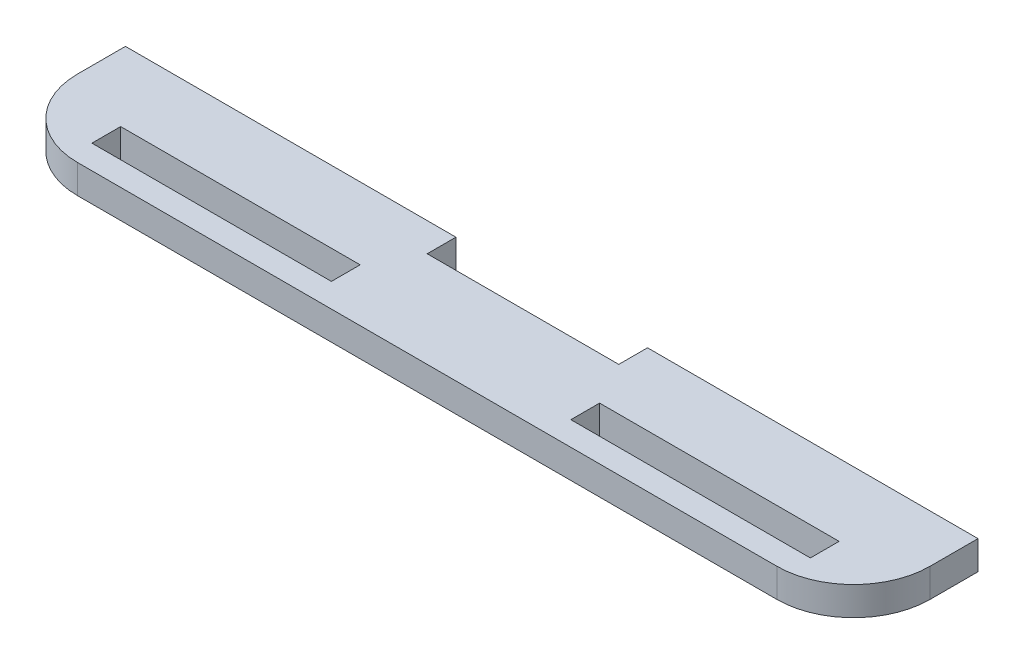
ISO-10303-21;
HEADER;
FILE_DESCRIPTION(('STEP AP214'),'2;1');
FILE_NAME('part.step','',(''),(''),'','','');
FILE_SCHEMA(('AUTOMOTIVE_DESIGN { 1 0 10303 214 1 1 1 1 }'));
ENDSEC;
DATA;
#1=APPLICATION_CONTEXT('core data for automotive mechanical design processes');
#2=APPLICATION_PROTOCOL_DEFINITION('international standard','automotive_design',2000,#1);
#3=PRODUCT_CONTEXT('',#1,'mechanical');
#4=PRODUCT('Part','Part','',(#3));
#5=PRODUCT_RELATED_PRODUCT_CATEGORY('part','',(#4));
#6=PRODUCT_DEFINITION_FORMATION('','',#4);
#7=PRODUCT_DEFINITION_CONTEXT('part definition',#1,'design');
#8=PRODUCT_DEFINITION('design','',#6,#7);
#9=PRODUCT_DEFINITION_SHAPE('','',#8);
#10=(LENGTH_UNIT() NAMED_UNIT(*) SI_UNIT(.MILLI.,.METRE.));
#11=(NAMED_UNIT(*) PLANE_ANGLE_UNIT() SI_UNIT($,.RADIAN.));
#12=(NAMED_UNIT(*) SI_UNIT($,.STERADIAN.) SOLID_ANGLE_UNIT());
#13=UNCERTAINTY_MEASURE_WITH_UNIT(LENGTH_MEASURE(1.E-05),#10,'distance_accuracy_value','');
#14=(GEOMETRIC_REPRESENTATION_CONTEXT(3) GLOBAL_UNCERTAINTY_ASSIGNED_CONTEXT((#13)) GLOBAL_UNIT_ASSIGNED_CONTEXT((#10,
#11,#12)) REPRESENTATION_CONTEXT('',''));
#15=CARTESIAN_POINT('',(0.,0.,0.));
#16=DIRECTION('',(0.,0.,1.));
#17=DIRECTION('',(1.,0.,0.));
#18=AXIS2_PLACEMENT_3D('',#15,#16,#17);
#19=CARTESIAN_POINT('',(0.,0.,-3.));
#20=DIRECTION('',(0.,0.,-1.));
#21=DIRECTION('',(0.,1.,0.));
#22=AXIS2_PLACEMENT_3D('',#19,#20,#21);
#23=PLANE('',#22);
#24=DIRECTION('',(0.,-1.,0.));
#25=VECTOR('',#24,1.);
#26=CARTESIAN_POINT('',(10.,0.,-3.));
#27=LINE('',#26,#25);
#28=CARTESIAN_POINT('',(10.,24.,-3.));
#29=VERTEX_POINT('',#28);
#30=CARTESIAN_POINT('',(10.,21.,-3.));
#31=VERTEX_POINT('',#30);
#32=EDGE_CURVE('E166',#29,#31,#27,.T.);
#33=ORIENTED_EDGE('',*,*,#32,.F.);
#34=DIRECTION('',(-1.,0.,0.));
#35=VECTOR('',#34,1.);
#36=CARTESIAN_POINT('',(44.5,24.,-3.));
#37=LINE('',#36,#35);
#38=CARTESIAN_POINT('',(44.5,24.,-3.));
#39=VERTEX_POINT('',#38);
#40=EDGE_CURVE('E180',#39,#29,#37,.T.);
#41=ORIENTED_EDGE('',*,*,#40,.F.);
#42=DIRECTION('',(0.,1.,0.));
#43=VECTOR('',#42,1.);
#44=CARTESIAN_POINT('',(44.5,24.,-3.));
#45=LINE('',#44,#43);
#46=CARTESIAN_POINT('',(44.5,21.,-3.));
#47=VERTEX_POINT('',#46);
#48=EDGE_CURVE('E202',#47,#39,#45,.T.);
#49=ORIENTED_EDGE('',*,*,#48,.F.);
#50=DIRECTION('',(1.,0.,0.));
#51=VECTOR('',#50,1.);
#52=CARTESIAN_POINT('',(44.5,21.,-3.));
#53=LINE('',#52,#51);
#54=EDGE_CURVE('E183',#31,#47,#53,.T.);
#55=ORIENTED_EDGE('',*,*,#54,.F.);
#56=EDGE_LOOP('',(#33,#41,#49,#55));
#57=FACE_BOUND('',#56,.T.);
#58=ADVANCED_FACE('F37',(#57),#23,.T.);
#59=CARTESIAN_POINT('',(44.5,21.,99.0505474435727));
#60=DIRECTION('',(0.,1.,0.));
#61=DIRECTION('',(0.,0.,1.));
#62=AXIS2_PLACEMENT_3D('',#59,#60,#61);
#63=PLANE('',#62);
#64=DIRECTION('',(1.,0.,0.));
#65=VECTOR('',#64,1.);
#66=CARTESIAN_POINT('',(12.5,21.,4.49999999999999));
#67=LINE('',#66,#65);
#68=CARTESIAN_POINT('',(12.5,21.,4.49999999999999));
#69=VERTEX_POINT('',#68);
#70=CARTESIAN_POINT('',(37.5,21.,4.49999999999999));
#71=VERTEX_POINT('',#70);
#72=EDGE_CURVE('E281',#69,#71,#67,.T.);
#73=ORIENTED_EDGE('',*,*,#72,.F.);
#74=DIRECTION('',(0.,0.,-1.));
#75=VECTOR('',#74,1.);
#76=CARTESIAN_POINT('',(12.5,21.,4.49999999999999));
#77=LINE('',#76,#75);
#78=CARTESIAN_POINT('',(12.5,21.,7.5));
#79=VERTEX_POINT('',#78);
#80=EDGE_CURVE('E275',#79,#69,#77,.T.);
#81=ORIENTED_EDGE('',*,*,#80,.F.);
#82=DIRECTION('',(-1.,0.,0.));
#83=VECTOR('',#82,1.);
#84=CARTESIAN_POINT('',(12.5,21.,7.5));
#85=LINE('',#84,#83);
#86=CARTESIAN_POINT('',(37.5,21.,7.50000000000001));
#87=VERTEX_POINT('',#86);
#88=EDGE_CURVE('E287',#87,#79,#85,.T.);
#89=ORIENTED_EDGE('',*,*,#88,.F.);
#90=DIRECTION('',(0.,0.,1.));
#91=VECTOR('',#90,1.);
#92=CARTESIAN_POINT('',(37.5,21.,4.49999999999999));
#93=LINE('',#92,#91);
#94=EDGE_CURVE('E284',#71,#87,#93,.T.);
#95=ORIENTED_EDGE('',*,*,#94,.F.);
#96=EDGE_LOOP('',(#73,#81,#89,#95));
#97=FACE_BOUND('',#96,.T.);
#98=DIRECTION('',(1.,0.,0.));
#99=VECTOR('',#98,1.);
#100=CARTESIAN_POINT('',(-37.5,21.,4.49999999999999));
#101=LINE('',#100,#99);
#102=CARTESIAN_POINT('',(-37.5,21.,4.49999999999999));
#103=VERTEX_POINT('',#102);
#104=CARTESIAN_POINT('',(-12.5,21.,4.49999999999999));
#105=VERTEX_POINT('',#104);
#106=EDGE_CURVE('E301',#103,#105,#101,.T.);
#107=ORIENTED_EDGE('',*,*,#106,.F.);
#108=DIRECTION('',(0.,0.,-1.));
#109=VECTOR('',#108,1.);
#110=CARTESIAN_POINT('',(-37.5,21.,4.49999999999999));
#111=LINE('',#110,#109);
#112=CARTESIAN_POINT('',(-37.5,21.,7.5));
#113=VERTEX_POINT('',#112);
#114=EDGE_CURVE('E293',#113,#103,#111,.T.);
#115=ORIENTED_EDGE('',*,*,#114,.F.);
#116=DIRECTION('',(-1.,0.,0.));
#117=VECTOR('',#116,1.);
#118=CARTESIAN_POINT('',(-37.5,21.,7.5));
#119=LINE('',#118,#117);
#120=CARTESIAN_POINT('',(-12.5,21.,7.5));
#121=VERTEX_POINT('',#120);
#122=EDGE_CURVE('E307',#121,#113,#119,.T.);
#123=ORIENTED_EDGE('',*,*,#122,.F.);
#124=DIRECTION('',(0.,0.,1.));
#125=VECTOR('',#124,1.);
#126=CARTESIAN_POINT('',(-12.5,21.,4.49999999999999));
#127=LINE('',#126,#125);
#128=EDGE_CURVE('E304',#105,#121,#127,.T.);
#129=ORIENTED_EDGE('',*,*,#128,.F.);
#130=EDGE_LOOP('',(#107,#115,#123,#129));
#131=FACE_BOUND('',#130,.T.);
#132=DIRECTION('',(-1.,0.,0.));
#133=VECTOR('',#132,1.);
#134=CARTESIAN_POINT('',(44.5,21.,9.99999999999999));
#135=LINE('',#134,#133);
#136=CARTESIAN_POINT('',(36.5,21.,9.99999999999999));
#137=VERTEX_POINT('',#136);
#138=CARTESIAN_POINT('',(-36.5,21.,9.99999999999999));
#139=VERTEX_POINT('',#138);
#140=EDGE_CURVE('E212',#137,#139,#135,.T.);
#141=ORIENTED_EDGE('',*,*,#140,.T.);
#142=CARTESIAN_POINT('',(-36.5,21.,2.));
#143=DIRECTION('',(0.,1.,0.));
#144=DIRECTION('',(0.,0.,1.));
#145=AXIS2_PLACEMENT_3D('',#142,#143,#144);
#146=CIRCLE('',#145,8.);
#147=CARTESIAN_POINT('',(-44.5,21.,2.));
#148=VERTEX_POINT('',#147);
#149=EDGE_CURVE('E45',#139,#148,#146,.F.);
#150=ORIENTED_EDGE('',*,*,#149,.T.);
#151=DIRECTION('',(0.,0.,-1.));
#152=VECTOR('',#151,1.);
#153=CARTESIAN_POINT('',(-44.5,21.,99.0505474435727));
#154=LINE('',#153,#152);
#155=CARTESIAN_POINT('',(-44.5,21.,-3.));
#156=VERTEX_POINT('',#155);
#157=EDGE_CURVE('E214',#148,#156,#154,.T.);
#158=ORIENTED_EDGE('',*,*,#157,.T.);
#159=CARTESIAN_POINT('',(-10.,21.,-3.));
#160=VERTEX_POINT('',#159);
#161=EDGE_CURVE('E205',#156,#160,#53,.T.);
#162=ORIENTED_EDGE('',*,*,#161,.T.);
#163=DIRECTION('',(0.,0.,1.));
#164=VECTOR('',#163,1.);
#165=CARTESIAN_POINT('',(-10.,21.,99.0505474435727));
#166=LINE('',#165,#164);
#167=CARTESIAN_POINT('',(-10.,21.,0.));
#168=VERTEX_POINT('',#167);
#169=EDGE_CURVE('E273',#160,#168,#166,.T.);
#170=ORIENTED_EDGE('',*,*,#169,.T.);
#171=DIRECTION('',(1.,0.,0.));
#172=VECTOR('',#171,1.);
#173=CARTESIAN_POINT('',(44.5,21.,0.));
#174=LINE('',#173,#172);
#175=CARTESIAN_POINT('',(10.,21.,0.));
#176=VERTEX_POINT('',#175);
#177=EDGE_CURVE('E272',#168,#176,#174,.T.);
#178=ORIENTED_EDGE('',*,*,#177,.T.);
#179=DIRECTION('',(0.,0.,-1.));
#180=VECTOR('',#179,1.);
#181=CARTESIAN_POINT('',(10.,21.,99.0505474435727));
#182=LINE('',#181,#180);
#183=EDGE_CURVE('E270',#176,#31,#182,.T.);
#184=ORIENTED_EDGE('',*,*,#183,.T.);
#185=ORIENTED_EDGE('',*,*,#54,.T.);
#186=DIRECTION('',(0.,0.,-1.));
#187=VECTOR('',#186,1.);
#188=CARTESIAN_POINT('',(44.5,21.,99.0505474435727));
#189=LINE('',#188,#187);
#190=CARTESIAN_POINT('',(44.5,21.,2.));
#191=VERTEX_POINT('',#190);
#192=EDGE_CURVE('E204',#191,#47,#189,.T.);
#193=ORIENTED_EDGE('',*,*,#192,.F.);
#194=CARTESIAN_POINT('',(36.5,21.,2.));
#195=DIRECTION('',(0.,1.,0.));
#196=DIRECTION('',(0.,0.,1.));
#197=AXIS2_PLACEMENT_3D('',#194,#195,#196);
#198=CIRCLE('',#197,8.);
#199=EDGE_CURVE('E52',#191,#137,#198,.F.);
#200=ORIENTED_EDGE('',*,*,#199,.T.);
#201=EDGE_LOOP('',(#141,#150,#158,#162,#170,#178,#184,#185,#193,#200));
#202=FACE_BOUND('',#201,.T.);
#203=ADVANCED_FACE('F256',(#97,#131,#202),#63,.F.);
#204=CARTESIAN_POINT('',(-44.5,24.,99.0505474435727));
#205=DIRECTION('',(1.,0.,0.));
#206=DIRECTION('',(0.,0.,-1.));
#207=AXIS2_PLACEMENT_3D('',#204,#205,#206);
#208=PLANE('',#207);
#209=ORIENTED_EDGE('',*,*,#157,.F.);
#210=DIRECTION('',(0.,1.,0.));
#211=VECTOR('',#210,1.);
#212=CARTESIAN_POINT('',(-44.5,24.,2.));
#213=LINE('',#212,#211);
#214=CARTESIAN_POINT('',(-44.5,24.,2.));
#215=VERTEX_POINT('',#214);
#216=EDGE_CURVE('E184',#148,#215,#213,.T.);
#217=ORIENTED_EDGE('',*,*,#216,.T.);
#218=DIRECTION('',(0.,0.,-1.));
#219=VECTOR('',#218,1.);
#220=CARTESIAN_POINT('',(-44.5,24.,99.0505474435727));
#221=LINE('',#220,#219);
#222=CARTESIAN_POINT('',(-44.5,24.,-3.));
#223=VERTEX_POINT('',#222);
#224=EDGE_CURVE('E216',#215,#223,#221,.T.);
#225=ORIENTED_EDGE('',*,*,#224,.T.);
#226=DIRECTION('',(0.,-1.,0.));
#227=VECTOR('',#226,1.);
#228=CARTESIAN_POINT('',(-44.5,24.,-3.));
#229=LINE('',#228,#227);
#230=EDGE_CURVE('E191',#223,#156,#229,.T.);
#231=ORIENTED_EDGE('',*,*,#230,.T.);
#232=EDGE_LOOP('',(#209,#217,#225,#231));
#233=FACE_BOUND('',#232,.T.);
#234=ADVANCED_FACE('F261',(#233),#208,.F.);
#235=CARTESIAN_POINT('',(44.5,24.,99.0505474435727));
#236=DIRECTION('',(0.,-1.,0.));
#237=DIRECTION('',(0.,0.,-1.));
#238=AXIS2_PLACEMENT_3D('',#235,#236,#237);
#239=PLANE('',#238);
#240=DIRECTION('',(-1.,0.,0.));
#241=VECTOR('',#240,1.);
#242=CARTESIAN_POINT('',(44.5,24.,7.50000000000001));
#243=LINE('',#242,#241);
#244=CARTESIAN_POINT('',(37.5,24.,7.50000000000001));
#245=VERTEX_POINT('',#244);
#246=CARTESIAN_POINT('',(12.5,24.,7.5));
#247=VERTEX_POINT('',#246);
#248=EDGE_CURVE('E237',#245,#247,#243,.T.);
#249=ORIENTED_EDGE('',*,*,#248,.T.);
#250=DIRECTION('',(0.,0.,-1.));
#251=VECTOR('',#250,1.);
#252=CARTESIAN_POINT('',(12.5000000000001,24.,99.0505474435728));
#253=LINE('',#252,#251);
#254=CARTESIAN_POINT('',(12.5,24.,4.49999999999999));
#255=VERTEX_POINT('',#254);
#256=EDGE_CURVE('E240',#247,#255,#253,.T.);
#257=ORIENTED_EDGE('',*,*,#256,.T.);
#258=DIRECTION('',(1.,0.,0.));
#259=VECTOR('',#258,1.);
#260=CARTESIAN_POINT('',(44.5,24.,4.49999999999999));
#261=LINE('',#260,#259);
#262=CARTESIAN_POINT('',(37.5,24.,4.49999999999999));
#263=VERTEX_POINT('',#262);
#264=EDGE_CURVE('E231',#255,#263,#261,.T.);
#265=ORIENTED_EDGE('',*,*,#264,.T.);
#266=DIRECTION('',(0.,0.,1.));
#267=VECTOR('',#266,1.);
#268=CARTESIAN_POINT('',(37.5,24.,99.0505474435727));
#269=LINE('',#268,#267);
#270=EDGE_CURVE('E234',#263,#245,#269,.T.);
#271=ORIENTED_EDGE('',*,*,#270,.T.);
#272=EDGE_LOOP('',(#249,#257,#265,#271));
#273=FACE_BOUND('',#272,.T.);
#274=DIRECTION('',(-1.,0.,0.));
#275=VECTOR('',#274,1.);
#276=CARTESIAN_POINT('',(44.5,24.,7.50000000000001));
#277=LINE('',#276,#275);
#278=CARTESIAN_POINT('',(-12.5,24.,7.5));
#279=VERTEX_POINT('',#278);
#280=CARTESIAN_POINT('',(-37.5,24.,7.5));
#281=VERTEX_POINT('',#280);
#282=EDGE_CURVE('E225',#279,#281,#277,.T.);
#283=ORIENTED_EDGE('',*,*,#282,.T.);
#284=DIRECTION('',(0.,0.,-1.));
#285=VECTOR('',#284,1.);
#286=CARTESIAN_POINT('',(-37.5,24.,99.0505474435727));
#287=LINE('',#286,#285);
#288=CARTESIAN_POINT('',(-37.5,24.,4.49999999999999));
#289=VERTEX_POINT('',#288);
#290=EDGE_CURVE('E228',#281,#289,#287,.T.);
#291=ORIENTED_EDGE('',*,*,#290,.T.);
#292=DIRECTION('',(1.,0.,0.));
#293=VECTOR('',#292,1.);
#294=CARTESIAN_POINT('',(44.5,24.,4.49999999999999));
#295=LINE('',#294,#293);
#296=CARTESIAN_POINT('',(-12.5,24.,4.49999999999999));
#297=VERTEX_POINT('',#296);
#298=EDGE_CURVE('E211',#289,#297,#295,.T.);
#299=ORIENTED_EDGE('',*,*,#298,.T.);
#300=DIRECTION('',(0.,0.,1.));
#301=VECTOR('',#300,1.);
#302=CARTESIAN_POINT('',(-12.5,24.,99.0505474435727));
#303=LINE('',#302,#301);
#304=EDGE_CURVE('E222',#297,#279,#303,.T.);
#305=ORIENTED_EDGE('',*,*,#304,.T.);
#306=EDGE_LOOP('',(#283,#291,#299,#305));
#307=FACE_BOUND('',#306,.T.);
#308=ORIENTED_EDGE('',*,*,#224,.F.);
#309=CARTESIAN_POINT('',(-36.5,24.,2.));
#310=DIRECTION('',(0.,-1.,0.));
#311=DIRECTION('',(0.,0.,-1.));
#312=AXIS2_PLACEMENT_3D('',#309,#310,#311);
#313=CIRCLE('',#312,8.);
#314=CARTESIAN_POINT('',(-36.5,24.,9.99999999999999));
#315=VERTEX_POINT('',#314);
#316=EDGE_CURVE('E248',#215,#315,#313,.F.);
#317=ORIENTED_EDGE('',*,*,#316,.T.);
#318=DIRECTION('',(1.,0.,0.));
#319=VECTOR('',#318,1.);
#320=CARTESIAN_POINT('',(44.5,24.,9.99999999999999));
#321=LINE('',#320,#319);
#322=CARTESIAN_POINT('',(36.5,24.,9.99999999999999));
#323=VERTEX_POINT('',#322);
#324=EDGE_CURVE('E208',#315,#323,#321,.T.);
#325=ORIENTED_EDGE('',*,*,#324,.T.);
#326=CARTESIAN_POINT('',(36.5,24.,2.));
#327=DIRECTION('',(0.,-1.,0.));
#328=DIRECTION('',(0.,0.,-1.));
#329=AXIS2_PLACEMENT_3D('',#326,#327,#328);
#330=CIRCLE('',#329,8.);
#331=CARTESIAN_POINT('',(44.5,24.,2.));
#332=VERTEX_POINT('',#331);
#333=EDGE_CURVE('E246',#323,#332,#330,.F.);
#334=ORIENTED_EDGE('',*,*,#333,.T.);
#335=DIRECTION('',(0.,0.,-1.));
#336=VECTOR('',#335,1.);
#337=CARTESIAN_POINT('',(44.5,24.,99.0505474435727));
#338=LINE('',#337,#336);
#339=EDGE_CURVE('E190',#332,#39,#338,.T.);
#340=ORIENTED_EDGE('',*,*,#339,.T.);
#341=ORIENTED_EDGE('',*,*,#40,.T.);
#342=DIRECTION('',(0.,0.,-1.));
#343=VECTOR('',#342,1.);
#344=CARTESIAN_POINT('',(10.,24.,-3.));
#345=LINE('',#344,#343);
#346=CARTESIAN_POINT('',(10.,24.,0.));
#347=VERTEX_POINT('',#346);
#348=EDGE_CURVE('E163',#347,#29,#345,.T.);
#349=ORIENTED_EDGE('',*,*,#348,.F.);
#350=DIRECTION('',(1.,0.,0.));
#351=VECTOR('',#350,1.);
#352=CARTESIAN_POINT('',(10.,24.,0.));
#353=LINE('',#352,#351);
#354=CARTESIAN_POINT('',(-10.,24.,0.));
#355=VERTEX_POINT('',#354);
#356=EDGE_CURVE('E366',#355,#347,#353,.T.);
#357=ORIENTED_EDGE('',*,*,#356,.F.);
#358=DIRECTION('',(0.,0.,1.));
#359=VECTOR('',#358,1.);
#360=CARTESIAN_POINT('',(-10.,24.,-3.));
#361=LINE('',#360,#359);
#362=CARTESIAN_POINT('',(-10.,24.,-3.));
#363=VERTEX_POINT('',#362);
#364=EDGE_CURVE('E174',#363,#355,#361,.T.);
#365=ORIENTED_EDGE('',*,*,#364,.F.);
#366=EDGE_CURVE('E192',#363,#223,#37,.T.);
#367=ORIENTED_EDGE('',*,*,#366,.T.);
#368=EDGE_LOOP('',(#308,#317,#325,#334,#340,#341,#349,#357,#365,#367));
#369=FACE_BOUND('',#368,.T.);
#370=ADVANCED_FACE('F188',(#273,#307,#369),#239,.F.);
#371=CARTESIAN_POINT('',(44.5,24.,99.0505474435727));
#372=DIRECTION('',(-1.,0.,0.));
#373=DIRECTION('',(0.,0.,1.));
#374=AXIS2_PLACEMENT_3D('',#371,#372,#373);
#375=PLANE('',#374);
#376=ORIENTED_EDGE('',*,*,#339,.F.);
#377=DIRECTION('',(0.,-1.,0.));
#378=VECTOR('',#377,1.);
#379=CARTESIAN_POINT('',(44.5,24.,2.));
#380=LINE('',#379,#378);
#381=EDGE_CURVE('E11',#332,#191,#380,.T.);
#382=ORIENTED_EDGE('',*,*,#381,.T.);
#383=ORIENTED_EDGE('',*,*,#192,.T.);
#384=ORIENTED_EDGE('',*,*,#48,.T.);
#385=EDGE_LOOP('',(#376,#382,#383,#384));
#386=FACE_BOUND('',#385,.T.);
#387=ADVANCED_FACE('F267',(#386),#375,.F.);
#388=CARTESIAN_POINT('',(0.,0.,10.));
#389=DIRECTION('',(0.,0.,-1.));
#390=DIRECTION('',(-1.,0.,0.));
#391=AXIS2_PLACEMENT_3D('',#388,#389,#390);
#392=PLANE('',#391);
#393=ORIENTED_EDGE('',*,*,#324,.F.);
#394=DIRECTION('',(0.,1.,0.));
#395=VECTOR('',#394,1.);
#396=CARTESIAN_POINT('',(-36.5,0.,10.));
#397=LINE('',#396,#395);
#398=EDGE_CURVE('E59',#315,#139,#397,.F.);
#399=ORIENTED_EDGE('',*,*,#398,.T.);
#400=ORIENTED_EDGE('',*,*,#140,.F.);
#401=DIRECTION('',(0.,-1.,0.));
#402=VECTOR('',#401,1.);
#403=CARTESIAN_POINT('',(36.5,0.,10.));
#404=LINE('',#403,#402);
#405=EDGE_CURVE('E250',#137,#323,#404,.F.);
#406=ORIENTED_EDGE('',*,*,#405,.T.);
#407=EDGE_LOOP('',(#393,#399,#400,#406));
#408=FACE_BOUND('',#407,.T.);
#409=ADVANCED_FACE('F265',(#408),#392,.F.);
#410=DIRECTION('',(0.,1.,0.));
#411=VECTOR('',#410,1.);
#412=CARTESIAN_POINT('',(-10.,0.,-3.));
#413=LINE('',#412,#411);
#414=EDGE_CURVE('E185',#160,#363,#413,.T.);
#415=ORIENTED_EDGE('',*,*,#414,.F.);
#416=ORIENTED_EDGE('',*,*,#161,.F.);
#417=ORIENTED_EDGE('',*,*,#230,.F.);
#418=ORIENTED_EDGE('',*,*,#366,.F.);
#419=EDGE_LOOP('',(#415,#416,#417,#418));
#420=FACE_BOUND('',#419,.T.);
#421=ADVANCED_FACE('F339',(#420),#23,.T.);
#422=CARTESIAN_POINT('',(-37.5,31.,4.49999999999999));
#423=DIRECTION('',(-1.,0.,0.));
#424=DIRECTION('',(0.,0.,1.));
#425=AXIS2_PLACEMENT_3D('',#422,#423,#424);
#426=PLANE('',#425);
#427=DIRECTION('',(0.,-1.,0.));
#428=VECTOR('',#427,1.);
#429=CARTESIAN_POINT('',(-37.5,31.,7.5));
#430=LINE('',#429,#428);
#431=EDGE_CURVE('E197',#281,#113,#430,.T.);
#432=ORIENTED_EDGE('',*,*,#431,.T.);
#433=ORIENTED_EDGE('',*,*,#114,.T.);
#434=DIRECTION('',(0.,-1.,0.));
#435=VECTOR('',#434,1.);
#436=CARTESIAN_POINT('',(-37.5,31.,4.49999999999999));
#437=LINE('',#436,#435);
#438=EDGE_CURVE('E200',#289,#103,#437,.T.);
#439=ORIENTED_EDGE('',*,*,#438,.F.);
#440=ORIENTED_EDGE('',*,*,#290,.F.);
#441=EDGE_LOOP('',(#432,#433,#439,#440));
#442=FACE_BOUND('',#441,.T.);
#443=ADVANCED_FACE('F330',(#442),#426,.F.);
#444=CARTESIAN_POINT('',(-37.5,31.,7.5));
#445=DIRECTION('',(0.,0.,1.));
#446=DIRECTION('',(1.,0.,0.));
#447=AXIS2_PLACEMENT_3D('',#444,#445,#446);
#448=PLANE('',#447);
#449=DIRECTION('',(0.,-1.,0.));
#450=VECTOR('',#449,1.);
#451=CARTESIAN_POINT('',(-12.5,31.,7.5));
#452=LINE('',#451,#450);
#453=EDGE_CURVE('E311',#279,#121,#452,.T.);
#454=ORIENTED_EDGE('',*,*,#453,.T.);
#455=ORIENTED_EDGE('',*,*,#122,.T.);
#456=ORIENTED_EDGE('',*,*,#431,.F.);
#457=ORIENTED_EDGE('',*,*,#282,.F.);
#458=EDGE_LOOP('',(#454,#455,#456,#457));
#459=FACE_BOUND('',#458,.T.);
#460=ADVANCED_FACE('F331',(#459),#448,.F.);
#461=CARTESIAN_POINT('',(-12.5,31.,4.49999999999999));
#462=DIRECTION('',(1.,0.,0.));
#463=DIRECTION('',(0.,0.,-1.));
#464=AXIS2_PLACEMENT_3D('',#461,#462,#463);
#465=PLANE('',#464);
#466=DIRECTION('',(0.,-1.,0.));
#467=VECTOR('',#466,1.);
#468=CARTESIAN_POINT('',(-12.5,31.,4.49999999999999));
#469=LINE('',#468,#467);
#470=EDGE_CURVE('E312',#297,#105,#469,.T.);
#471=ORIENTED_EDGE('',*,*,#470,.T.);
#472=ORIENTED_EDGE('',*,*,#128,.T.);
#473=ORIENTED_EDGE('',*,*,#453,.F.);
#474=ORIENTED_EDGE('',*,*,#304,.F.);
#475=EDGE_LOOP('',(#471,#472,#473,#474));
#476=FACE_BOUND('',#475,.T.);
#477=ADVANCED_FACE('F326',(#476),#465,.F.);
#478=CARTESIAN_POINT('',(-37.5,31.,4.49999999999999));
#479=DIRECTION('',(0.,0.,-1.));
#480=DIRECTION('',(-1.,0.,0.));
#481=AXIS2_PLACEMENT_3D('',#478,#479,#480);
#482=PLANE('',#481);
#483=ORIENTED_EDGE('',*,*,#438,.T.);
#484=ORIENTED_EDGE('',*,*,#106,.T.);
#485=ORIENTED_EDGE('',*,*,#470,.F.);
#486=ORIENTED_EDGE('',*,*,#298,.F.);
#487=EDGE_LOOP('',(#483,#484,#485,#486));
#488=FACE_BOUND('',#487,.T.);
#489=ADVANCED_FACE('F319',(#488),#482,.F.);
#490=CARTESIAN_POINT('',(12.5,31.,4.49999999999999));
#491=DIRECTION('',(-1.,0.,0.));
#492=DIRECTION('',(0.,0.,1.));
#493=AXIS2_PLACEMENT_3D('',#490,#491,#492);
#494=PLANE('',#493);
#495=DIRECTION('',(0.,-1.,0.));
#496=VECTOR('',#495,1.);
#497=CARTESIAN_POINT('',(12.5,31.,7.5));
#498=LINE('',#497,#496);
#499=EDGE_CURVE('E291',#247,#79,#498,.T.);
#500=ORIENTED_EDGE('',*,*,#499,.T.);
#501=ORIENTED_EDGE('',*,*,#80,.T.);
#502=DIRECTION('',(0.,-1.,0.));
#503=VECTOR('',#502,1.);
#504=CARTESIAN_POINT('',(12.5,31.,4.49999999999999));
#505=LINE('',#504,#503);
#506=EDGE_CURVE('E290',#255,#69,#505,.T.);
#507=ORIENTED_EDGE('',*,*,#506,.F.);
#508=ORIENTED_EDGE('',*,*,#256,.F.);
#509=EDGE_LOOP('',(#500,#501,#507,#508));
#510=FACE_BOUND('',#509,.T.);
#511=ADVANCED_FACE('F387',(#510),#494,.F.);
#512=CARTESIAN_POINT('',(12.5,31.,7.5));
#513=DIRECTION('',(0.,0.,1.));
#514=DIRECTION('',(1.,0.,0.));
#515=AXIS2_PLACEMENT_3D('',#512,#513,#514);
#516=PLANE('',#515);
#517=DIRECTION('',(0.,-1.,0.));
#518=VECTOR('',#517,1.);
#519=CARTESIAN_POINT('',(37.5,31.,7.50000000000001));
#520=LINE('',#519,#518);
#521=EDGE_CURVE('E294',#245,#87,#520,.T.);
#522=ORIENTED_EDGE('',*,*,#521,.T.);
#523=ORIENTED_EDGE('',*,*,#88,.T.);
#524=ORIENTED_EDGE('',*,*,#499,.F.);
#525=ORIENTED_EDGE('',*,*,#248,.F.);
#526=EDGE_LOOP('',(#522,#523,#524,#525));
#527=FACE_BOUND('',#526,.T.);
#528=ADVANCED_FACE('F384',(#527),#516,.F.);
#529=CARTESIAN_POINT('',(37.5,31.,4.49999999999999));
#530=DIRECTION('',(1.,0.,0.));
#531=DIRECTION('',(0.,0.,-1.));
#532=AXIS2_PLACEMENT_3D('',#529,#530,#531);
#533=PLANE('',#532);
#534=DIRECTION('',(0.,-1.,0.));
#535=VECTOR('',#534,1.);
#536=CARTESIAN_POINT('',(37.5,31.,4.49999999999999));
#537=LINE('',#536,#535);
#538=EDGE_CURVE('E296',#263,#71,#537,.T.);
#539=ORIENTED_EDGE('',*,*,#538,.T.);
#540=ORIENTED_EDGE('',*,*,#94,.T.);
#541=ORIENTED_EDGE('',*,*,#521,.F.);
#542=ORIENTED_EDGE('',*,*,#270,.F.);
#543=EDGE_LOOP('',(#539,#540,#541,#542));
#544=FACE_BOUND('',#543,.T.);
#545=ADVANCED_FACE('F378',(#544),#533,.F.);
#546=CARTESIAN_POINT('',(12.5,31.,4.49999999999999));
#547=DIRECTION('',(0.,0.,-1.));
#548=DIRECTION('',(-1.,0.,0.));
#549=AXIS2_PLACEMENT_3D('',#546,#547,#548);
#550=PLANE('',#549);
#551=ORIENTED_EDGE('',*,*,#506,.T.);
#552=ORIENTED_EDGE('',*,*,#72,.T.);
#553=ORIENTED_EDGE('',*,*,#538,.F.);
#554=ORIENTED_EDGE('',*,*,#264,.F.);
#555=EDGE_LOOP('',(#551,#552,#553,#554));
#556=FACE_BOUND('',#555,.T.);
#557=ADVANCED_FACE('F372',(#556),#550,.F.);
#558=CARTESIAN_POINT('',(10.,14.,0.));
#559=DIRECTION('',(0.,0.,1.));
#560=DIRECTION('',(1.,0.,0.));
#561=AXIS2_PLACEMENT_3D('',#558,#559,#560);
#562=PLANE('',#561);
#563=DIRECTION('',(0.,1.,0.));
#564=VECTOR('',#563,1.);
#565=CARTESIAN_POINT('',(-10.,14.,0.));
#566=LINE('',#565,#564);
#567=EDGE_CURVE('E364',#168,#355,#566,.T.);
#568=ORIENTED_EDGE('',*,*,#567,.T.);
#569=ORIENTED_EDGE('',*,*,#356,.T.);
#570=DIRECTION('',(0.,1.,0.));
#571=VECTOR('',#570,1.);
#572=CARTESIAN_POINT('',(10.,14.,0.));
#573=LINE('',#572,#571);
#574=EDGE_CURVE('E169',#176,#347,#573,.T.);
#575=ORIENTED_EDGE('',*,*,#574,.F.);
#576=ORIENTED_EDGE('',*,*,#177,.F.);
#577=EDGE_LOOP('',(#568,#569,#575,#576));
#578=FACE_BOUND('',#577,.T.);
#579=ADVANCED_FACE('F370',(#578),#562,.F.);
#580=CARTESIAN_POINT('',(10.,14.,-3.));
#581=DIRECTION('',(1.,0.,0.));
#582=DIRECTION('',(0.,0.,-1.));
#583=AXIS2_PLACEMENT_3D('',#580,#581,#582);
#584=PLANE('',#583);
#585=ORIENTED_EDGE('',*,*,#574,.T.);
#586=ORIENTED_EDGE('',*,*,#348,.T.);
#587=ORIENTED_EDGE('',*,*,#32,.T.);
#588=ORIENTED_EDGE('',*,*,#183,.F.);
#589=EDGE_LOOP('',(#585,#586,#587,#588));
#590=FACE_BOUND('',#589,.T.);
#591=ADVANCED_FACE('F165',(#590),#584,.F.);
#592=CARTESIAN_POINT('',(-10.,14.,-3.));
#593=DIRECTION('',(-1.,0.,0.));
#594=DIRECTION('',(0.,0.,1.));
#595=AXIS2_PLACEMENT_3D('',#592,#593,#594);
#596=PLANE('',#595);
#597=ORIENTED_EDGE('',*,*,#414,.T.);
#598=ORIENTED_EDGE('',*,*,#364,.T.);
#599=ORIENTED_EDGE('',*,*,#567,.F.);
#600=ORIENTED_EDGE('',*,*,#169,.F.);
#601=EDGE_LOOP('',(#597,#598,#599,#600));
#602=FACE_BOUND('',#601,.T.);
#603=ADVANCED_FACE('F363',(#602),#596,.F.);
#604=CARTESIAN_POINT('',(-36.5,24.,2.));
#605=DIRECTION('',(0.,1.,0.));
#606=DIRECTION('',(0.,0.,1.));
#607=AXIS2_PLACEMENT_3D('',#604,#605,#606);
#608=CYLINDRICAL_SURFACE('',#607,8.);
#609=ORIENTED_EDGE('',*,*,#149,.F.);
#610=ORIENTED_EDGE('',*,*,#398,.F.);
#611=ORIENTED_EDGE('',*,*,#316,.F.);
#612=ORIENTED_EDGE('',*,*,#216,.F.);
#613=EDGE_LOOP('',(#609,#610,#611,#612));
#614=FACE_BOUND('',#613,.T.);
#615=ADVANCED_FACE('F263',(#614),#608,.T.);
#616=CARTESIAN_POINT('',(36.5,24.,2.));
#617=DIRECTION('',(0.,-1.,0.));
#618=DIRECTION('',(0.,0.,-1.));
#619=AXIS2_PLACEMENT_3D('',#616,#617,#618);
#620=CYLINDRICAL_SURFACE('',#619,8.);
#621=ORIENTED_EDGE('',*,*,#333,.F.);
#622=ORIENTED_EDGE('',*,*,#405,.F.);
#623=ORIENTED_EDGE('',*,*,#199,.F.);
#624=ORIENTED_EDGE('',*,*,#381,.F.);
#625=EDGE_LOOP('',(#621,#622,#623,#624));
#626=FACE_BOUND('',#625,.T.);
#627=ADVANCED_FACE('F39',(#626),#620,.T.);
#628=CLOSED_SHELL('',(#58,#203,#234,#370,#387,#409,#421,#443,#460,#477,#489,#511,#528,#545,#557,
#579,#591,#603,#615,#627));
#629=MANIFOLD_SOLID_BREP('B2',#628);
#630=ADVANCED_BREP_SHAPE_REPRESENTATION('',(#18,#629),#14);
#631=SHAPE_DEFINITION_REPRESENTATION(#9,#630);
ENDSEC;
END-ISO-10303-21;
